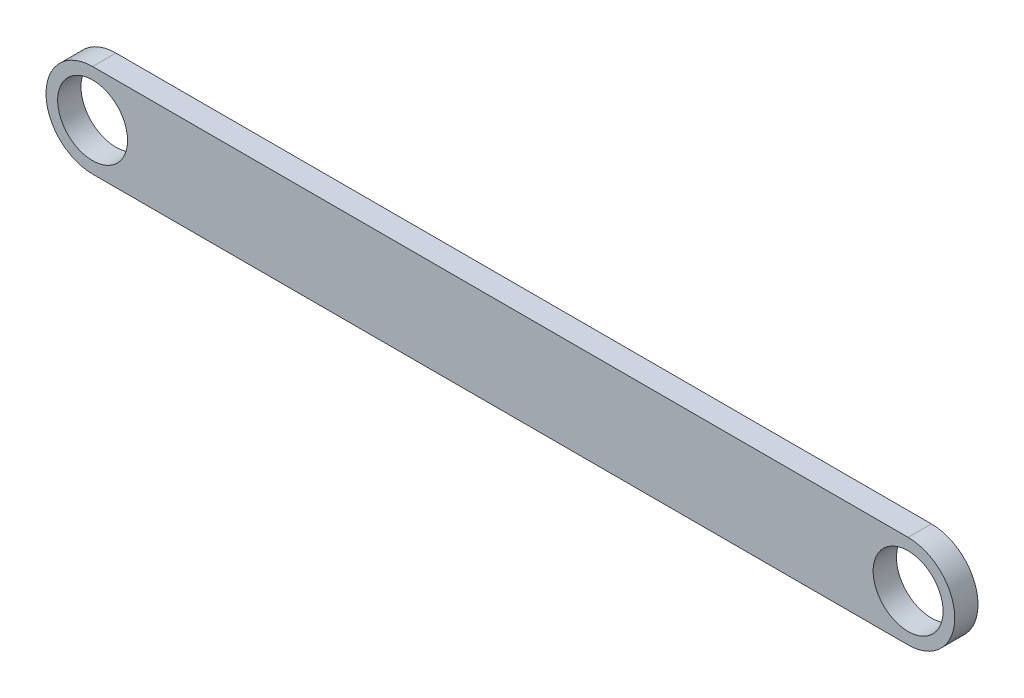
ISO-10303-21;
HEADER;
FILE_DESCRIPTION(('STEP AP214'),'2;1');
FILE_NAME('part.step','',(''),(''),'','','');
FILE_SCHEMA(('AUTOMOTIVE_DESIGN { 1 0 10303 214 1 1 1 1 }'));
ENDSEC;
DATA;
#1=APPLICATION_CONTEXT('core data for automotive mechanical design processes');
#2=APPLICATION_PROTOCOL_DEFINITION('international standard','automotive_design',2000,#1);
#3=PRODUCT_CONTEXT('',#1,'mechanical');
#4=PRODUCT('Part','Part','',(#3));
#5=PRODUCT_RELATED_PRODUCT_CATEGORY('part','',(#4));
#6=PRODUCT_DEFINITION_FORMATION('','',#4);
#7=PRODUCT_DEFINITION_CONTEXT('part definition',#1,'design');
#8=PRODUCT_DEFINITION('design','',#6,#7);
#9=PRODUCT_DEFINITION_SHAPE('','',#8);
#10=(LENGTH_UNIT() NAMED_UNIT(*) SI_UNIT(.MILLI.,.METRE.));
#11=(NAMED_UNIT(*) PLANE_ANGLE_UNIT() SI_UNIT($,.RADIAN.));
#12=(NAMED_UNIT(*) SI_UNIT($,.STERADIAN.) SOLID_ANGLE_UNIT());
#13=UNCERTAINTY_MEASURE_WITH_UNIT(LENGTH_MEASURE(1.E-05),#10,'distance_accuracy_value','');
#14=(GEOMETRIC_REPRESENTATION_CONTEXT(3) GLOBAL_UNCERTAINTY_ASSIGNED_CONTEXT((#13)) GLOBAL_UNIT_ASSIGNED_CONTEXT((#10,
#11,#12)) REPRESENTATION_CONTEXT('',''));
#15=CARTESIAN_POINT('',(0.,0.,0.));
#16=DIRECTION('',(0.,0.,1.));
#17=DIRECTION('',(1.,0.,0.));
#18=AXIS2_PLACEMENT_3D('',#15,#16,#17);
#19=CARTESIAN_POINT('',(-62.5479607167275,38.0032012495993,0.5));
#20=DIRECTION('',(0.,0.,1.));
#21=DIRECTION('',(1.,0.,0.));
#22=AXIS2_PLACEMENT_3D('',#19,#20,#21);
#23=PLANE('',#22);
#24=CARTESIAN_POINT('',(-62.5479607167275,38.0032012495993,0.5));
#25=DIRECTION('',(0.,0.,1.));
#26=DIRECTION('',(1.,0.,0.));
#27=AXIS2_PLACEMENT_3D('',#24,#25,#26);
#28=CIRCLE('',#27,1.5);
#29=CARTESIAN_POINT('',(-61.0479607167275,38.0032012495993,0.5));
#30=VERTEX_POINT('',#29);
#31=EDGE_CURVE('E102',#30,#30,#28,.T.);
#32=ORIENTED_EDGE('',*,*,#31,.F.);
#33=EDGE_LOOP('',(#32));
#34=FACE_BOUND('',#33,.T.);
#35=CARTESIAN_POINT('',(-62.5479607167275,38.0032012495993,0.5));
#36=DIRECTION('',(0.,0.,1.));
#37=DIRECTION('',(1.,0.,0.));
#38=AXIS2_PLACEMENT_3D('',#35,#36,#37);
#39=CIRCLE('',#38,2.);
#40=CARTESIAN_POINT('',(-62.5479607167275,40.0032012495993,0.5));
#41=VERTEX_POINT('',#40);
#42=CARTESIAN_POINT('',(-62.5479607167275,36.0032012495993,0.5));
#43=VERTEX_POINT('',#42);
#44=EDGE_CURVE('E87',#41,#43,#39,.T.);
#45=ORIENTED_EDGE('',*,*,#44,.T.);
#46=DIRECTION('',(1.,0.,0.));
#47=VECTOR('',#46,1.);
#48=CARTESIAN_POINT('',(-62.5479607167275,36.0032012495993,0.5));
#49=LINE('',#48,#47);
#50=CARTESIAN_POINT('',(-27.5479607167275,36.0032012495993,0.5));
#51=VERTEX_POINT('',#50);
#52=EDGE_CURVE('E82',#43,#51,#49,.T.);
#53=ORIENTED_EDGE('',*,*,#52,.T.);
#54=CARTESIAN_POINT('',(-27.5479607167275,38.0032012495993,0.5));
#55=DIRECTION('',(0.,0.,1.));
#56=DIRECTION('',(1.,0.,0.));
#57=AXIS2_PLACEMENT_3D('',#54,#55,#56);
#58=CIRCLE('',#57,2.);
#59=CARTESIAN_POINT('',(-27.5479607167275,40.0032012495993,0.5));
#60=VERTEX_POINT('',#59);
#61=EDGE_CURVE('E85',#51,#60,#58,.T.);
#62=ORIENTED_EDGE('',*,*,#61,.T.);
#63=DIRECTION('',(-1.,0.,0.));
#64=VECTOR('',#63,1.);
#65=CARTESIAN_POINT('',(-62.5479607167275,40.0032012495993,0.5));
#66=LINE('',#65,#64);
#67=EDGE_CURVE('E52',#60,#41,#66,.T.);
#68=ORIENTED_EDGE('',*,*,#67,.T.);
#69=EDGE_LOOP('',(#45,#53,#62,#68));
#70=FACE_BOUND('',#69,.T.);
#71=CARTESIAN_POINT('',(-27.5479607167275,38.0032012495993,0.5));
#72=DIRECTION('',(0.,0.,1.));
#73=DIRECTION('',(1.,0.,0.));
#74=AXIS2_PLACEMENT_3D('',#71,#72,#73);
#75=CIRCLE('',#74,1.5);
#76=CARTESIAN_POINT('',(-26.0479607167275,38.0032012495993,0.5));
#77=VERTEX_POINT('',#76);
#78=EDGE_CURVE('E117',#77,#77,#75,.T.);
#79=ORIENTED_EDGE('',*,*,#78,.F.);
#80=EDGE_LOOP('',(#79));
#81=FACE_BOUND('',#80,.T.);
#82=ADVANCED_FACE('F35',(#34,#70,#81),#23,.T.);
#83=CARTESIAN_POINT('',(-62.5479607167275,38.0032012495993,-0.5));
#84=DIRECTION('',(0.,0.,1.));
#85=DIRECTION('',(1.,0.,0.));
#86=AXIS2_PLACEMENT_3D('',#83,#84,#85);
#87=PLANE('',#86);
#88=CARTESIAN_POINT('',(-62.5479607167275,38.0032012495993,-0.5));
#89=DIRECTION('',(0.,0.,1.));
#90=DIRECTION('',(1.,0.,0.));
#91=AXIS2_PLACEMENT_3D('',#88,#89,#90);
#92=CIRCLE('',#91,2.);
#93=CARTESIAN_POINT('',(-62.5479607167275,40.0032012495993,-0.5));
#94=VERTEX_POINT('',#93);
#95=CARTESIAN_POINT('',(-62.5479607167275,36.0032012495993,-0.5));
#96=VERTEX_POINT('',#95);
#97=EDGE_CURVE('E99',#94,#96,#92,.T.);
#98=ORIENTED_EDGE('',*,*,#97,.F.);
#99=DIRECTION('',(-1.,0.,0.));
#100=VECTOR('',#99,1.);
#101=CARTESIAN_POINT('',(-62.5479607167275,40.0032012495993,-0.5));
#102=LINE('',#101,#100);
#103=CARTESIAN_POINT('',(-27.5479607167275,40.0032012495993,-0.5));
#104=VERTEX_POINT('',#103);
#105=EDGE_CURVE('E75',#104,#94,#102,.T.);
#106=ORIENTED_EDGE('',*,*,#105,.F.);
#107=CARTESIAN_POINT('',(-27.5479607167275,38.0032012495993,-0.5));
#108=DIRECTION('',(0.,0.,1.));
#109=DIRECTION('',(1.,0.,0.));
#110=AXIS2_PLACEMENT_3D('',#107,#108,#109);
#111=CIRCLE('',#110,2.);
#112=CARTESIAN_POINT('',(-27.5479607167275,36.0032012495993,-0.5));
#113=VERTEX_POINT('',#112);
#114=EDGE_CURVE('E69',#113,#104,#111,.T.);
#115=ORIENTED_EDGE('',*,*,#114,.F.);
#116=DIRECTION('',(1.,0.,0.));
#117=VECTOR('',#116,1.);
#118=CARTESIAN_POINT('',(-62.5479607167275,36.0032012495993,-0.5));
#119=LINE('',#118,#117);
#120=EDGE_CURVE('E91',#96,#113,#119,.T.);
#121=ORIENTED_EDGE('',*,*,#120,.F.);
#122=EDGE_LOOP('',(#98,#106,#115,#121));
#123=FACE_BOUND('',#122,.T.);
#124=CARTESIAN_POINT('',(-62.5479607167275,38.0032012495993,-0.5));
#125=DIRECTION('',(0.,0.,1.));
#126=DIRECTION('',(1.,0.,0.));
#127=AXIS2_PLACEMENT_3D('',#124,#125,#126);
#128=CIRCLE('',#127,1.5);
#129=CARTESIAN_POINT('',(-61.0479607167275,38.0032012495993,-0.5));
#130=VERTEX_POINT('',#129);
#131=EDGE_CURVE('E114',#130,#130,#128,.T.);
#132=ORIENTED_EDGE('',*,*,#131,.T.);
#133=EDGE_LOOP('',(#132));
#134=FACE_BOUND('',#133,.T.);
#135=CARTESIAN_POINT('',(-27.5479607167275,38.0032012495993,-0.5));
#136=DIRECTION('',(0.,0.,1.));
#137=DIRECTION('',(1.,0.,0.));
#138=AXIS2_PLACEMENT_3D('',#135,#136,#137);
#139=CIRCLE('',#138,1.5);
#140=CARTESIAN_POINT('',(-26.0479607167275,38.0032012495993,-0.5));
#141=VERTEX_POINT('',#140);
#142=EDGE_CURVE('E120',#141,#141,#139,.T.);
#143=ORIENTED_EDGE('',*,*,#142,.T.);
#144=EDGE_LOOP('',(#143));
#145=FACE_BOUND('',#144,.T.);
#146=ADVANCED_FACE('F110',(#123,#134,#145),#87,.F.);
#147=CARTESIAN_POINT('',(-62.5479607167275,38.0032012495993,0.5));
#148=DIRECTION('',(0.,0.,-1.));
#149=DIRECTION('',(-1.,0.,0.));
#150=AXIS2_PLACEMENT_3D('',#147,#148,#149);
#151=CYLINDRICAL_SURFACE('',#150,2.);
#152=ORIENTED_EDGE('',*,*,#97,.T.);
#153=DIRECTION('',(0.,0.,-1.));
#154=VECTOR('',#153,1.);
#155=CARTESIAN_POINT('',(-62.5479607167275,36.0032012495993,0.5));
#156=LINE('',#155,#154);
#157=EDGE_CURVE('E11',#43,#96,#156,.T.);
#158=ORIENTED_EDGE('',*,*,#157,.F.);
#159=ORIENTED_EDGE('',*,*,#44,.F.);
#160=DIRECTION('',(0.,0.,-1.));
#161=VECTOR('',#160,1.);
#162=CARTESIAN_POINT('',(-62.5479607167275,40.0032012495993,0.5));
#163=LINE('',#162,#161);
#164=EDGE_CURVE('E95',#41,#94,#163,.T.);
#165=ORIENTED_EDGE('',*,*,#164,.T.);
#166=EDGE_LOOP('',(#152,#158,#159,#165));
#167=FACE_BOUND('',#166,.T.);
#168=ADVANCED_FACE('F37',(#167),#151,.T.);
#169=CARTESIAN_POINT('',(-62.5479607167275,36.0032012495993,0.5));
#170=DIRECTION('',(0.,1.,0.));
#171=DIRECTION('',(0.,0.,1.));
#172=AXIS2_PLACEMENT_3D('',#169,#170,#171);
#173=PLANE('',#172);
#174=ORIENTED_EDGE('',*,*,#120,.T.);
#175=DIRECTION('',(0.,0.,-1.));
#176=VECTOR('',#175,1.);
#177=CARTESIAN_POINT('',(-27.5479607167275,36.0032012495993,0.5));
#178=LINE('',#177,#176);
#179=EDGE_CURVE('E44',#51,#113,#178,.T.);
#180=ORIENTED_EDGE('',*,*,#179,.F.);
#181=ORIENTED_EDGE('',*,*,#52,.F.);
#182=ORIENTED_EDGE('',*,*,#157,.T.);
#183=EDGE_LOOP('',(#174,#180,#181,#182));
#184=FACE_BOUND('',#183,.T.);
#185=ADVANCED_FACE('F90',(#184),#173,.F.);
#186=CARTESIAN_POINT('',(-27.5479607167275,38.0032012495993,0.5));
#187=DIRECTION('',(0.,0.,-1.));
#188=DIRECTION('',(-1.,0.,0.));
#189=AXIS2_PLACEMENT_3D('',#186,#187,#188);
#190=CYLINDRICAL_SURFACE('',#189,2.);
#191=ORIENTED_EDGE('',*,*,#114,.T.);
#192=DIRECTION('',(0.,0.,-1.));
#193=VECTOR('',#192,1.);
#194=CARTESIAN_POINT('',(-27.5479607167275,40.0032012495993,0.5));
#195=LINE('',#194,#193);
#196=EDGE_CURVE('E92',#60,#104,#195,.T.);
#197=ORIENTED_EDGE('',*,*,#196,.F.);
#198=ORIENTED_EDGE('',*,*,#61,.F.);
#199=ORIENTED_EDGE('',*,*,#179,.T.);
#200=EDGE_LOOP('',(#191,#197,#198,#199));
#201=FACE_BOUND('',#200,.T.);
#202=ADVANCED_FACE('F93',(#201),#190,.T.);
#203=CARTESIAN_POINT('',(-62.5479607167275,40.0032012495993,0.5));
#204=DIRECTION('',(0.,-1.,0.));
#205=DIRECTION('',(0.,0.,-1.));
#206=AXIS2_PLACEMENT_3D('',#203,#204,#205);
#207=PLANE('',#206);
#208=ORIENTED_EDGE('',*,*,#105,.T.);
#209=ORIENTED_EDGE('',*,*,#164,.F.);
#210=ORIENTED_EDGE('',*,*,#67,.F.);
#211=ORIENTED_EDGE('',*,*,#196,.T.);
#212=EDGE_LOOP('',(#208,#209,#210,#211));
#213=FACE_BOUND('',#212,.T.);
#214=ADVANCED_FACE('F107',(#213),#207,.F.);
#215=CARTESIAN_POINT('',(-62.5479607167275,38.0032012495993,0.5));
#216=DIRECTION('',(0.,0.,-1.));
#217=DIRECTION('',(-1.,0.,0.));
#218=AXIS2_PLACEMENT_3D('',#215,#216,#217);
#219=CYLINDRICAL_SURFACE('',#218,1.5);
#220=ORIENTED_EDGE('',*,*,#31,.T.);
#221=EDGE_LOOP('',(#220));
#222=FACE_BOUND('',#221,.T.);
#223=ORIENTED_EDGE('',*,*,#131,.F.);
#224=EDGE_LOOP('',(#223));
#225=FACE_BOUND('',#224,.T.);
#226=ADVANCED_FACE('F137',(#222,#225),#219,.F.);
#227=CARTESIAN_POINT('',(-27.5479607167275,38.0032012495993,0.5));
#228=DIRECTION('',(0.,0.,-1.));
#229=DIRECTION('',(-1.,0.,0.));
#230=AXIS2_PLACEMENT_3D('',#227,#228,#229);
#231=CYLINDRICAL_SURFACE('',#230,1.5);
#232=ORIENTED_EDGE('',*,*,#78,.T.);
#233=EDGE_LOOP('',(#232));
#234=FACE_BOUND('',#233,.T.);
#235=ORIENTED_EDGE('',*,*,#142,.F.);
#236=EDGE_LOOP('',(#235));
#237=FACE_BOUND('',#236,.T.);
#238=ADVANCED_FACE('F126',(#234,#237),#231,.F.);
#239=CLOSED_SHELL('',(#82,#146,#168,#185,#202,#214,#226,#238));
#240=MANIFOLD_SOLID_BREP('B2',#239);
#241=ADVANCED_BREP_SHAPE_REPRESENTATION('',(#18,#240),#14);
#242=SHAPE_DEFINITION_REPRESENTATION(#9,#241);
ENDSEC;
END-ISO-10303-21;
